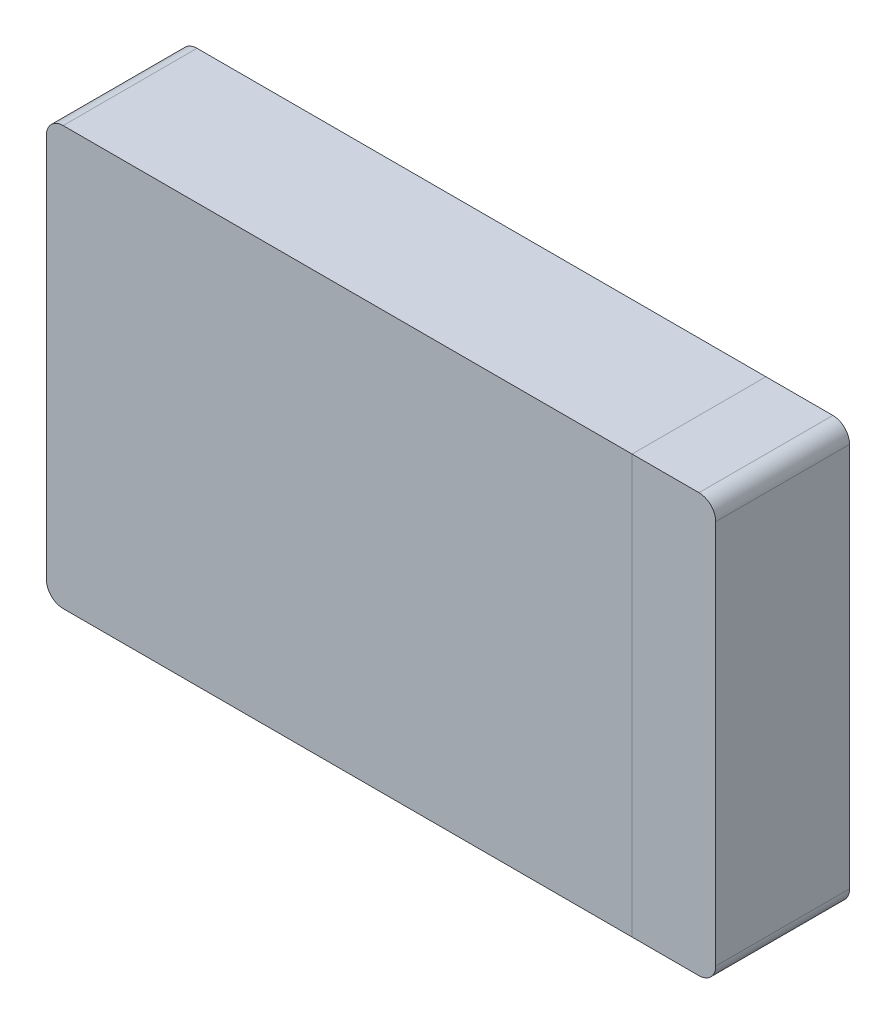
ISO-10303-21;
HEADER;
FILE_DESCRIPTION(('STEP AP214'),'2;1');
FILE_NAME('part.step','',(''),(''),'','','');
FILE_SCHEMA(('AUTOMOTIVE_DESIGN { 1 0 10303 214 1 1 1 1 }'));
ENDSEC;
DATA;
#1=APPLICATION_CONTEXT('core data for automotive mechanical design processes');
#2=APPLICATION_PROTOCOL_DEFINITION('international standard','automotive_design',2000,#1);
#3=PRODUCT_CONTEXT('',#1,'mechanical');
#4=PRODUCT('Part','Part','',(#3));
#5=PRODUCT_RELATED_PRODUCT_CATEGORY('part','',(#4));
#6=PRODUCT_DEFINITION_FORMATION('','',#4);
#7=PRODUCT_DEFINITION_CONTEXT('part definition',#1,'design');
#8=PRODUCT_DEFINITION('design','',#6,#7);
#9=PRODUCT_DEFINITION_SHAPE('','',#8);
#10=(LENGTH_UNIT() NAMED_UNIT(*) SI_UNIT(.MILLI.,.METRE.));
#11=(NAMED_UNIT(*) PLANE_ANGLE_UNIT() SI_UNIT($,.RADIAN.));
#12=(NAMED_UNIT(*) SI_UNIT($,.STERADIAN.) SOLID_ANGLE_UNIT());
#13=UNCERTAINTY_MEASURE_WITH_UNIT(LENGTH_MEASURE(1.E-05),#10,'distance_accuracy_value','');
#14=(GEOMETRIC_REPRESENTATION_CONTEXT(3) GLOBAL_UNCERTAINTY_ASSIGNED_CONTEXT((#13)) GLOBAL_UNIT_ASSIGNED_CONTEXT((#10,
#11,#12)) REPRESENTATION_CONTEXT('',''));
#15=CARTESIAN_POINT('',(0.,0.,0.));
#16=DIRECTION('',(0.,0.,1.));
#17=DIRECTION('',(1.,0.,0.));
#18=AXIS2_PLACEMENT_3D('',#15,#16,#17);
#19=CARTESIAN_POINT('',(-60.9477612163516,13.1713226586686,8.));
#20=DIRECTION('',(1.,0.,0.));
#21=DIRECTION('',(0.,1.,0.));
#22=AXIS2_PLACEMENT_3D('',#19,#20,#21);
#23=PLANE('',#22);
#24=DIRECTION('',(0.,-1.,0.));
#25=VECTOR('',#24,1.);
#26=CARTESIAN_POINT('',(-60.9477612163516,13.1713226586686,0.));
#27=LINE('',#26,#25);
#28=CARTESIAN_POINT('',(-60.9477612163516,13.1713226586686,0.));
#29=VERTEX_POINT('',#28);
#30=CARTESIAN_POINT('',(-60.9477612163516,-11.8286773413314,0.));
#31=VERTEX_POINT('',#30);
#32=EDGE_CURVE('P0_E11',#29,#31,#27,.T.);
#33=ORIENTED_EDGE('',*,*,#32,.T.);
#34=DIRECTION('',(0.,0.,-1.));
#35=VECTOR('',#34,1.);
#36=CARTESIAN_POINT('',(-60.9477612163516,-11.8286773413314,8.));
#37=LINE('',#36,#35);
#38=CARTESIAN_POINT('',(-60.9477612163516,-11.8286773413314,8.));
#39=VERTEX_POINT('',#38);
#40=EDGE_CURVE('P0_E42',#39,#31,#37,.T.);
#41=ORIENTED_EDGE('',*,*,#40,.F.);
#42=DIRECTION('',(0.,-1.,0.));
#43=VECTOR('',#42,1.);
#44=CARTESIAN_POINT('',(-60.9477612163516,13.1713226586686,8.));
#45=LINE('',#44,#43);
#46=CARTESIAN_POINT('',(-60.9477612163516,13.1713226586686,8.));
#47=VERTEX_POINT('',#46);
#48=EDGE_CURVE('P0_E124',#47,#39,#45,.T.);
#49=ORIENTED_EDGE('',*,*,#48,.F.);
#50=DIRECTION('',(0.,0.,-1.));
#51=VECTOR('',#50,1.);
#52=CARTESIAN_POINT('',(-60.9477612163516,13.1713226586686,8.));
#53=LINE('',#52,#51);
#54=EDGE_CURVE('P0_E27',#47,#29,#53,.T.);
#55=ORIENTED_EDGE('',*,*,#54,.T.);
#56=EDGE_LOOP('',(#33,#41,#49,#55));
#57=FACE_BOUND('',#56,.T.);
#58=ADVANCED_FACE('P0_F17',(#57),#23,.F.);
#59=CARTESIAN_POINT('',(-60.9477612163516,-11.8286773413314,8.));
#60=DIRECTION('',(0.,1.,0.));
#61=DIRECTION('',(1.,0.,0.));
#62=AXIS2_PLACEMENT_3D('',#59,#60,#61);
#63=PLANE('',#62);
#64=DIRECTION('',(1.,0.,0.));
#65=VECTOR('',#64,1.);
#66=CARTESIAN_POINT('',(-60.9477612163516,-11.8286773413314,0.));
#67=LINE('',#66,#65);
#68=CARTESIAN_POINT('',(-56.9477612163516,-11.8286773413314,0.));
#69=VERTEX_POINT('',#68);
#70=EDGE_CURVE('P0_E130',#31,#69,#67,.T.);
#71=ORIENTED_EDGE('',*,*,#70,.T.);
#72=DIRECTION('',(0.,0.,-1.));
#73=VECTOR('',#72,1.);
#74=CARTESIAN_POINT('',(-56.9477612163516,-11.8286773413314,8.));
#75=LINE('',#74,#73);
#76=CARTESIAN_POINT('',(-56.9477612163516,-11.8286773413314,8.));
#77=VERTEX_POINT('',#76);
#78=EDGE_CURVE('P0_E123',#77,#69,#75,.T.);
#79=ORIENTED_EDGE('',*,*,#78,.F.);
#80=DIRECTION('',(1.,0.,0.));
#81=VECTOR('',#80,1.);
#82=CARTESIAN_POINT('',(-60.9477612163516,-11.8286773413314,8.));
#83=LINE('',#82,#81);
#84=EDGE_CURVE('P0_E97',#39,#77,#83,.T.);
#85=ORIENTED_EDGE('',*,*,#84,.F.);
#86=ORIENTED_EDGE('',*,*,#40,.T.);
#87=EDGE_LOOP('',(#71,#79,#85,#86));
#88=FACE_BOUND('',#87,.T.);
#89=ADVANCED_FACE('P0_F204',(#88),#63,.F.);
#90=CARTESIAN_POINT('',(-56.9477612163516,-10.8286773413314,8.));
#91=DIRECTION('',(0.,0.,-1.));
#92=DIRECTION('',(-1.,0.,0.));
#93=AXIS2_PLACEMENT_3D('',#90,#91,#92);
#94=CYLINDRICAL_SURFACE('',#93,1.);
#95=CARTESIAN_POINT('',(-56.9477612163516,-10.8286773413314,0.));
#96=DIRECTION('',(0.,0.,1.));
#97=DIRECTION('',(1.,0.,0.));
#98=AXIS2_PLACEMENT_3D('',#95,#96,#97);
#99=CIRCLE('',#98,1.);
#100=CARTESIAN_POINT('',(-55.9477612163516,-10.8286773413314,0.));
#101=VERTEX_POINT('',#100);
#102=EDGE_CURVE('P0_E103',#69,#101,#99,.T.);
#103=ORIENTED_EDGE('',*,*,#102,.T.);
#104=DIRECTION('',(0.,0.,-1.));
#105=VECTOR('',#104,1.);
#106=CARTESIAN_POINT('',(-55.9477612163516,-10.8286773413314,8.));
#107=LINE('',#106,#105);
#108=CARTESIAN_POINT('',(-55.9477612163516,-10.8286773413314,8.));
#109=VERTEX_POINT('',#108);
#110=EDGE_CURVE('P0_E83',#109,#101,#107,.T.);
#111=ORIENTED_EDGE('',*,*,#110,.F.);
#112=CARTESIAN_POINT('',(-56.9477612163516,-10.8286773413314,8.));
#113=DIRECTION('',(0.,0.,1.));
#114=DIRECTION('',(1.,0.,0.));
#115=AXIS2_PLACEMENT_3D('',#112,#113,#114);
#116=CIRCLE('',#115,1.);
#117=EDGE_CURVE('P0_E92',#77,#109,#116,.T.);
#118=ORIENTED_EDGE('',*,*,#117,.F.);
#119=ORIENTED_EDGE('',*,*,#78,.T.);
#120=EDGE_LOOP('',(#103,#111,#118,#119));
#121=FACE_BOUND('',#120,.T.);
#122=ADVANCED_FACE('P0_F101',(#121),#94,.T.);
#123=CARTESIAN_POINT('',(-55.9477612163516,12.1713226586686,8.));
#124=DIRECTION('',(-1.,0.,0.));
#125=DIRECTION('',(0.,0.,1.));
#126=AXIS2_PLACEMENT_3D('',#123,#124,#125);
#127=PLANE('',#126);
#128=DIRECTION('',(0.,1.,0.));
#129=VECTOR('',#128,1.);
#130=CARTESIAN_POINT('',(-55.9477612163516,12.1713226586686,0.));
#131=LINE('',#130,#129);
#132=CARTESIAN_POINT('',(-55.9477612163516,12.1713226586686,0.));
#133=VERTEX_POINT('',#132);
#134=EDGE_CURVE('P0_E106',#101,#133,#131,.T.);
#135=ORIENTED_EDGE('',*,*,#134,.T.);
#136=DIRECTION('',(0.,0.,-1.));
#137=VECTOR('',#136,1.);
#138=CARTESIAN_POINT('',(-55.9477612163516,12.1713226586686,8.));
#139=LINE('',#138,#137);
#140=CARTESIAN_POINT('',(-55.9477612163516,12.1713226586686,8.));
#141=VERTEX_POINT('',#140);
#142=EDGE_CURVE('P0_E110',#141,#133,#139,.T.);
#143=ORIENTED_EDGE('',*,*,#142,.F.);
#144=DIRECTION('',(0.,1.,0.));
#145=VECTOR('',#144,1.);
#146=CARTESIAN_POINT('',(-55.9477612163516,12.1713226586686,8.));
#147=LINE('',#146,#145);
#148=EDGE_CURVE('P0_E95',#109,#141,#147,.T.);
#149=ORIENTED_EDGE('',*,*,#148,.F.);
#150=ORIENTED_EDGE('',*,*,#110,.T.);
#151=EDGE_LOOP('',(#135,#143,#149,#150));
#152=FACE_BOUND('',#151,.T.);
#153=ADVANCED_FACE('P0_F109',(#152),#127,.F.);
#154=CARTESIAN_POINT('',(-56.9477612163516,12.1713226586686,8.));
#155=DIRECTION('',(0.,0.,-1.));
#156=DIRECTION('',(-1.,0.,0.));
#157=AXIS2_PLACEMENT_3D('',#154,#155,#156);
#158=CYLINDRICAL_SURFACE('',#157,1.);
#159=CARTESIAN_POINT('',(-56.9477612163516,12.1713226586686,0.));
#160=DIRECTION('',(0.,0.,1.));
#161=DIRECTION('',(-1.,0.,0.));
#162=AXIS2_PLACEMENT_3D('',#159,#160,#161);
#163=CIRCLE('',#162,1.);
#164=CARTESIAN_POINT('',(-56.9477612163516,13.1713226586686,0.));
#165=VERTEX_POINT('',#164);
#166=EDGE_CURVE('P0_E107',#133,#165,#163,.T.);
#167=ORIENTED_EDGE('',*,*,#166,.T.);
#168=DIRECTION('',(0.,0.,-1.));
#169=VECTOR('',#168,1.);
#170=CARTESIAN_POINT('',(-56.9477612163516,13.1713226586686,8.));
#171=LINE('',#170,#169);
#172=CARTESIAN_POINT('',(-56.9477612163516,13.1713226586686,8.));
#173=VERTEX_POINT('',#172);
#174=EDGE_CURVE('P0_E127',#173,#165,#171,.T.);
#175=ORIENTED_EDGE('',*,*,#174,.F.);
#176=CARTESIAN_POINT('',(-56.9477612163516,12.1713226586686,8.));
#177=DIRECTION('',(0.,0.,1.));
#178=DIRECTION('',(-1.,0.,0.));
#179=AXIS2_PLACEMENT_3D('',#176,#177,#178);
#180=CIRCLE('',#179,1.);
#181=EDGE_CURVE('P0_E20',#141,#173,#180,.T.);
#182=ORIENTED_EDGE('',*,*,#181,.F.);
#183=ORIENTED_EDGE('',*,*,#142,.T.);
#184=EDGE_LOOP('',(#167,#175,#182,#183));
#185=FACE_BOUND('',#184,.T.);
#186=ADVANCED_FACE('P0_F222',(#185),#158,.T.);
#187=CARTESIAN_POINT('',(-60.9477612163516,13.1713226586686,8.));
#188=DIRECTION('',(0.,-1.,0.));
#189=DIRECTION('',(0.,0.,-1.));
#190=AXIS2_PLACEMENT_3D('',#187,#188,#189);
#191=PLANE('',#190);
#192=DIRECTION('',(-1.,0.,0.));
#193=VECTOR('',#192,1.);
#194=CARTESIAN_POINT('',(-60.9477612163516,13.1713226586686,0.));
#195=LINE('',#194,#193);
#196=EDGE_CURVE('P0_E416',#165,#29,#195,.T.);
#197=ORIENTED_EDGE('',*,*,#196,.T.);
#198=ORIENTED_EDGE('',*,*,#54,.F.);
#199=DIRECTION('',(-1.,0.,0.));
#200=VECTOR('',#199,1.);
#201=CARTESIAN_POINT('',(-60.9477612163516,13.1713226586686,8.));
#202=LINE('',#201,#200);
#203=EDGE_CURVE('P0_E118',#173,#47,#202,.T.);
#204=ORIENTED_EDGE('',*,*,#203,.F.);
#205=ORIENTED_EDGE('',*,*,#174,.T.);
#206=EDGE_LOOP('',(#197,#198,#204,#205));
#207=FACE_BOUND('',#206,.T.);
#208=ADVANCED_FACE('P0_F146',(#207),#191,.F.);
#209=CARTESIAN_POINT('',(-56.9477612163516,-10.8286773413314,8.));
#210=DIRECTION('',(0.,0.,1.));
#211=DIRECTION('',(1.,0.,0.));
#212=AXIS2_PLACEMENT_3D('',#209,#210,#211);
#213=PLANE('',#212);
#214=ORIENTED_EDGE('',*,*,#48,.T.);
#215=ORIENTED_EDGE('',*,*,#84,.T.);
#216=ORIENTED_EDGE('',*,*,#117,.T.);
#217=ORIENTED_EDGE('',*,*,#148,.T.);
#218=ORIENTED_EDGE('',*,*,#181,.T.);
#219=ORIENTED_EDGE('',*,*,#203,.T.);
#220=EDGE_LOOP('',(#214,#215,#216,#217,#218,#219));
#221=FACE_BOUND('',#220,.T.);
#222=ADVANCED_FACE('P0_F93',(#221),#213,.T.);
#223=CARTESIAN_POINT('',(-56.9477612163516,-10.8286773413314,0.));
#224=DIRECTION('',(0.,0.,1.));
#225=DIRECTION('',(1.,0.,0.));
#226=AXIS2_PLACEMENT_3D('',#223,#224,#225);
#227=PLANE('',#226);
#228=ORIENTED_EDGE('',*,*,#32,.F.);
#229=ORIENTED_EDGE('',*,*,#196,.F.);
#230=ORIENTED_EDGE('',*,*,#166,.F.);
#231=ORIENTED_EDGE('',*,*,#134,.F.);
#232=ORIENTED_EDGE('',*,*,#102,.F.);
#233=ORIENTED_EDGE('',*,*,#70,.F.);
#234=EDGE_LOOP('',(#228,#229,#230,#231,#232,#233));
#235=FACE_BOUND('',#234,.T.);
#236=ADVANCED_FACE('P0_F229',(#235),#227,.F.);
#237=CLOSED_SHELL('',(#58,#89,#122,#153,#186,#208,#222,#236));
#238=MANIFOLD_SOLID_BREP('P0_B1',#237);
#239=CARTESIAN_POINT('',(-60.9477612163519,13.1713226586682,0.));
#240=DIRECTION('',(-1.,0.,0.));
#241=DIRECTION('',(0.,1.,0.));
#242=AXIS2_PLACEMENT_3D('',#239,#240,#241);
#243=PLANE('',#242);
#244=DIRECTION('',(0.,-1.,0.));
#245=VECTOR('',#244,1.);
#246=CARTESIAN_POINT('',(-60.9477612163519,13.1713226586682,8.));
#247=LINE('',#246,#245);
#248=CARTESIAN_POINT('',(-60.9477612163519,13.1713226586682,8.));
#249=VERTEX_POINT('',#248);
#250=CARTESIAN_POINT('',(-60.9477612163519,-11.8286773413318,8.));
#251=VERTEX_POINT('',#250);
#252=EDGE_CURVE('P1_E10',#249,#251,#247,.T.);
#253=ORIENTED_EDGE('',*,*,#252,.T.);
#254=DIRECTION('',(0.,0.,1.));
#255=VECTOR('',#254,1.);
#256=CARTESIAN_POINT('',(-60.9477612163519,-11.8286773413318,0.));
#257=LINE('',#256,#255);
#258=CARTESIAN_POINT('',(-60.9477612163519,-11.8286773413318,0.));
#259=VERTEX_POINT('',#258);
#260=EDGE_CURVE('P1_E41',#259,#251,#257,.T.);
#261=ORIENTED_EDGE('',*,*,#260,.F.);
#262=DIRECTION('',(0.,-1.,0.));
#263=VECTOR('',#262,1.);
#264=CARTESIAN_POINT('',(-60.9477612163519,13.1713226586682,0.));
#265=LINE('',#264,#263);
#266=CARTESIAN_POINT('',(-60.9477612163519,13.1713226586682,0.));
#267=VERTEX_POINT('',#266);
#268=EDGE_CURVE('P1_E120',#267,#259,#265,.T.);
#269=ORIENTED_EDGE('',*,*,#268,.F.);
#270=DIRECTION('',(0.,0.,1.));
#271=VECTOR('',#270,1.);
#272=CARTESIAN_POINT('',(-60.9477612163519,13.1713226586682,0.));
#273=LINE('',#272,#271);
#274=EDGE_CURVE('P1_E26',#267,#249,#273,.T.);
#275=ORIENTED_EDGE('',*,*,#274,.T.);
#276=EDGE_LOOP('',(#253,#261,#269,#275));
#277=FACE_BOUND('',#276,.T.);
#278=ADVANCED_FACE('P1_F16',(#277),#243,.F.);
#279=CARTESIAN_POINT('',(-60.9477612163519,-11.8286773413318,0.));
#280=DIRECTION('',(0.,1.,0.));
#281=DIRECTION('',(-1.,0.,0.));
#282=AXIS2_PLACEMENT_3D('',#279,#280,#281);
#283=PLANE('',#282);
#284=DIRECTION('',(-1.,0.,0.));
#285=VECTOR('',#284,1.);
#286=CARTESIAN_POINT('',(-60.9477612163519,-11.8286773413318,8.));
#287=LINE('',#286,#285);
#288=CARTESIAN_POINT('',(-94.9477612163519,-11.8286773413318,8.));
#289=VERTEX_POINT('',#288);
#290=EDGE_CURVE('P1_E123',#251,#289,#287,.T.);
#291=ORIENTED_EDGE('',*,*,#290,.T.);
#292=DIRECTION('',(0.,0.,1.));
#293=VECTOR('',#292,1.);
#294=CARTESIAN_POINT('',(-94.9477612163519,-11.8286773413318,0.));
#295=LINE('',#294,#293);
#296=CARTESIAN_POINT('',(-94.9477612163519,-11.8286773413318,0.));
#297=VERTEX_POINT('',#296);
#298=EDGE_CURVE('P1_E136',#297,#289,#295,.T.);
#299=ORIENTED_EDGE('',*,*,#298,.F.);
#300=DIRECTION('',(-1.,0.,0.));
#301=VECTOR('',#300,1.);
#302=CARTESIAN_POINT('',(-60.9477612163519,-11.8286773413318,0.));
#303=LINE('',#302,#301);
#304=EDGE_CURVE('P1_E92',#259,#297,#303,.T.);
#305=ORIENTED_EDGE('',*,*,#304,.F.);
#306=ORIENTED_EDGE('',*,*,#260,.T.);
#307=EDGE_LOOP('',(#291,#299,#305,#306));
#308=FACE_BOUND('',#307,.T.);
#309=ADVANCED_FACE('P1_F259',(#308),#283,.F.);
#310=CARTESIAN_POINT('',(-94.9477612163519,-10.8286773413318,0.));
#311=DIRECTION('',(0.,0.,1.));
#312=DIRECTION('',(1.,0.,0.));
#313=AXIS2_PLACEMENT_3D('',#310,#311,#312);
#314=CYLINDRICAL_SURFACE('',#313,1.);
#315=CARTESIAN_POINT('',(-94.9477612163519,-10.8286773413318,8.));
#316=DIRECTION('',(0.,0.,-1.));
#317=DIRECTION('',(-1.,0.,0.));
#318=AXIS2_PLACEMENT_3D('',#315,#316,#317);
#319=CIRCLE('',#318,1.);
#320=CARTESIAN_POINT('',(-95.9477612163519,-10.8286773413318,8.));
#321=VERTEX_POINT('',#320);
#322=EDGE_CURVE('P1_E100',#289,#321,#319,.T.);
#323=ORIENTED_EDGE('',*,*,#322,.T.);
#324=DIRECTION('',(0.,0.,1.));
#325=VECTOR('',#324,1.);
#326=CARTESIAN_POINT('',(-95.9477612163519,-10.8286773413318,0.));
#327=LINE('',#326,#325);
#328=CARTESIAN_POINT('',(-95.9477612163519,-10.8286773413318,0.));
#329=VERTEX_POINT('',#328);
#330=EDGE_CURVE('P1_E79',#329,#321,#327,.T.);
#331=ORIENTED_EDGE('',*,*,#330,.F.);
#332=CARTESIAN_POINT('',(-94.9477612163519,-10.8286773413318,0.));
#333=DIRECTION('',(0.,0.,-1.));
#334=DIRECTION('',(-1.,0.,0.));
#335=AXIS2_PLACEMENT_3D('',#332,#333,#334);
#336=CIRCLE('',#335,1.);
#337=EDGE_CURVE('P1_E88',#297,#329,#336,.T.);
#338=ORIENTED_EDGE('',*,*,#337,.F.);
#339=ORIENTED_EDGE('',*,*,#298,.T.);
#340=EDGE_LOOP('',(#323,#331,#338,#339));
#341=FACE_BOUND('',#340,.T.);
#342=ADVANCED_FACE('P1_F98',(#341),#314,.T.);
#343=CARTESIAN_POINT('',(-95.9477612163519,12.1713226586682,0.));
#344=DIRECTION('',(1.,0.,0.));
#345=DIRECTION('',(0.,1.,0.));
#346=AXIS2_PLACEMENT_3D('',#343,#344,#345);
#347=PLANE('',#346);
#348=DIRECTION('',(0.,1.,0.));
#349=VECTOR('',#348,1.);
#350=CARTESIAN_POINT('',(-95.9477612163519,12.1713226586682,8.));
#351=LINE('',#350,#349);
#352=CARTESIAN_POINT('',(-95.9477612163519,12.1713226586682,8.));
#353=VERTEX_POINT('',#352);
#354=EDGE_CURVE('P1_E103',#321,#353,#351,.T.);
#355=ORIENTED_EDGE('',*,*,#354,.T.);
#356=DIRECTION('',(0.,0.,1.));
#357=VECTOR('',#356,1.);
#358=CARTESIAN_POINT('',(-95.9477612163519,12.1713226586682,0.));
#359=LINE('',#358,#357);
#360=CARTESIAN_POINT('',(-95.9477612163519,12.1713226586682,0.));
#361=VERTEX_POINT('',#360);
#362=EDGE_CURVE('P1_E19',#361,#353,#359,.T.);
#363=ORIENTED_EDGE('',*,*,#362,.F.);
#364=DIRECTION('',(0.,1.,0.));
#365=VECTOR('',#364,1.);
#366=CARTESIAN_POINT('',(-95.9477612163519,12.1713226586682,0.));
#367=LINE('',#366,#365);
#368=EDGE_CURVE('P1_E90',#329,#361,#367,.T.);
#369=ORIENTED_EDGE('',*,*,#368,.F.);
#370=ORIENTED_EDGE('',*,*,#330,.T.);
#371=EDGE_LOOP('',(#355,#363,#369,#370));
#372=FACE_BOUND('',#371,.T.);
#373=ADVANCED_FACE('P1_F106',(#372),#347,.F.);
#374=CARTESIAN_POINT('',(-94.9477612163519,12.1713226586682,0.));
#375=DIRECTION('',(0.,0.,1.));
#376=DIRECTION('',(1.,0.,0.));
#377=AXIS2_PLACEMENT_3D('',#374,#375,#376);
#378=CYLINDRICAL_SURFACE('',#377,1.);
#379=CARTESIAN_POINT('',(-94.9477612163519,12.1713226586682,8.));
#380=DIRECTION('',(0.,0.,-1.));
#381=DIRECTION('',(1.,0.,0.));
#382=AXIS2_PLACEMENT_3D('',#379,#380,#381);
#383=CIRCLE('',#382,1.);
#384=CARTESIAN_POINT('',(-94.9477612163519,13.1713226586682,8.));
#385=VERTEX_POINT('',#384);
#386=EDGE_CURVE('P1_E104',#353,#385,#383,.T.);
#387=ORIENTED_EDGE('',*,*,#386,.T.);
#388=DIRECTION('',(0.,0.,1.));
#389=VECTOR('',#388,1.);
#390=CARTESIAN_POINT('',(-94.9477612163519,13.1713226586682,0.));
#391=LINE('',#390,#389);
#392=CARTESIAN_POINT('',(-94.9477612163519,13.1713226586682,0.));
#393=VERTEX_POINT('',#392);
#394=EDGE_CURVE('P1_E128',#393,#385,#391,.T.);
#395=ORIENTED_EDGE('',*,*,#394,.F.);
#396=CARTESIAN_POINT('',(-94.9477612163519,12.1713226586682,0.));
#397=DIRECTION('',(0.,0.,-1.));
#398=DIRECTION('',(1.,0.,0.));
#399=AXIS2_PLACEMENT_3D('',#396,#397,#398);
#400=CIRCLE('',#399,1.);
#401=EDGE_CURVE('P1_E109',#361,#393,#400,.T.);
#402=ORIENTED_EDGE('',*,*,#401,.F.);
#403=ORIENTED_EDGE('',*,*,#362,.T.);
#404=EDGE_LOOP('',(#387,#395,#402,#403));
#405=FACE_BOUND('',#404,.T.);
#406=ADVANCED_FACE('P1_F229',(#405),#378,.T.);
#407=CARTESIAN_POINT('',(-60.9477612163519,13.1713226586682,0.));
#408=DIRECTION('',(0.,-1.,0.));
#409=DIRECTION('',(0.,0.,1.));
#410=AXIS2_PLACEMENT_3D('',#407,#408,#409);
#411=PLANE('',#410);
#412=DIRECTION('',(1.,0.,0.));
#413=VECTOR('',#412,1.);
#414=CARTESIAN_POINT('',(-60.9477612163519,13.1713226586682,8.));
#415=LINE('',#414,#413);
#416=EDGE_CURVE('P1_E124',#385,#249,#415,.T.);
#417=ORIENTED_EDGE('',*,*,#416,.T.);
#418=ORIENTED_EDGE('',*,*,#274,.F.);
#419=DIRECTION('',(1.,0.,0.));
#420=VECTOR('',#419,1.);
#421=CARTESIAN_POINT('',(-60.9477612163519,13.1713226586682,0.));
#422=LINE('',#421,#420);
#423=EDGE_CURVE('P1_E115',#393,#267,#422,.T.);
#424=ORIENTED_EDGE('',*,*,#423,.F.);
#425=ORIENTED_EDGE('',*,*,#394,.T.);
#426=EDGE_LOOP('',(#417,#418,#424,#425));
#427=FACE_BOUND('',#426,.T.);
#428=ADVANCED_FACE('P1_F240',(#427),#411,.F.);
#429=CARTESIAN_POINT('',(-94.9477612163519,-10.8286773413318,0.));
#430=DIRECTION('',(0.,0.,-1.));
#431=DIRECTION('',(-1.,0.,0.));
#432=AXIS2_PLACEMENT_3D('',#429,#430,#431);
#433=PLANE('',#432);
#434=ORIENTED_EDGE('',*,*,#268,.T.);
#435=ORIENTED_EDGE('',*,*,#304,.T.);
#436=ORIENTED_EDGE('',*,*,#337,.T.);
#437=ORIENTED_EDGE('',*,*,#368,.T.);
#438=ORIENTED_EDGE('',*,*,#401,.T.);
#439=ORIENTED_EDGE('',*,*,#423,.T.);
#440=EDGE_LOOP('',(#434,#435,#436,#437,#438,#439));
#441=FACE_BOUND('',#440,.T.);
#442=ADVANCED_FACE('P1_F89',(#441),#433,.T.);
#443=CARTESIAN_POINT('',(-94.9477612163519,-10.8286773413318,8.));
#444=DIRECTION('',(0.,0.,-1.));
#445=DIRECTION('',(-1.,0.,0.));
#446=AXIS2_PLACEMENT_3D('',#443,#444,#445);
#447=PLANE('',#446);
#448=ORIENTED_EDGE('',*,*,#252,.F.);
#449=ORIENTED_EDGE('',*,*,#416,.F.);
#450=ORIENTED_EDGE('',*,*,#386,.F.);
#451=ORIENTED_EDGE('',*,*,#354,.F.);
#452=ORIENTED_EDGE('',*,*,#322,.F.);
#453=ORIENTED_EDGE('',*,*,#290,.F.);
#454=EDGE_LOOP('',(#448,#449,#450,#451,#452,#453));
#455=FACE_BOUND('',#454,.T.);
#456=ADVANCED_FACE('P1_F280',(#455),#447,.F.);
#457=CLOSED_SHELL('',(#278,#309,#342,#373,#406,#428,#442,#456));
#458=MANIFOLD_SOLID_BREP('P1_B1',#457);
#459=ADVANCED_BREP_SHAPE_REPRESENTATION('',(#18,#238,#458),#14);
#460=SHAPE_DEFINITION_REPRESENTATION(#9,#459);
ENDSEC;
END-ISO-10303-21;
